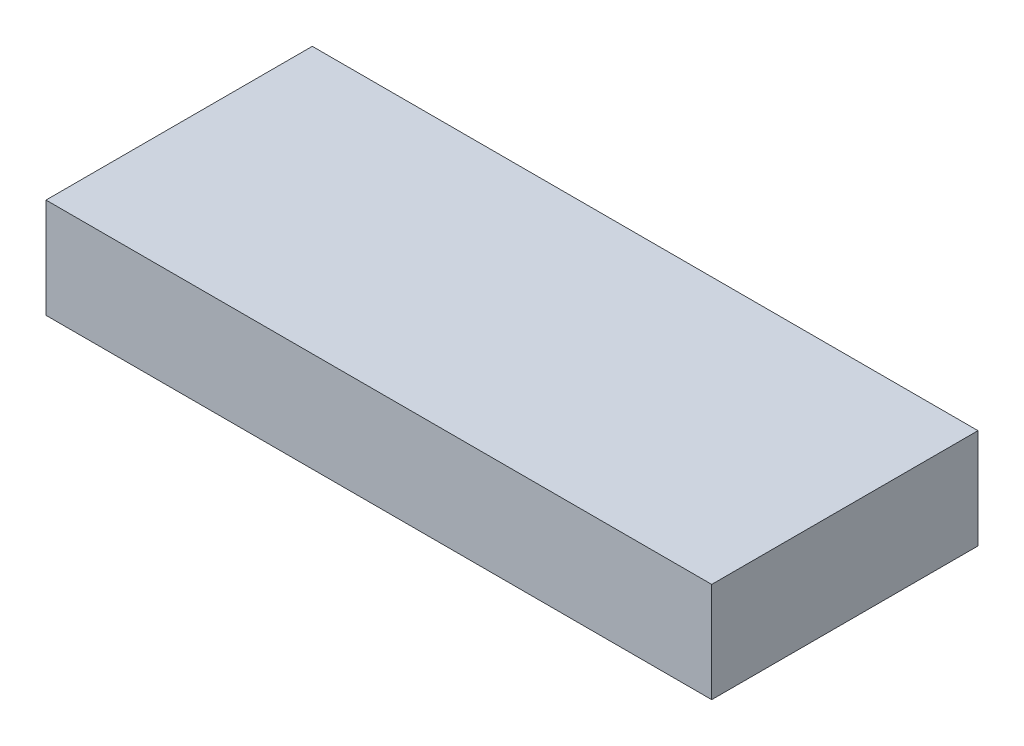
ISO-10303-21;
HEADER;
FILE_DESCRIPTION(('STEP AP214'),'2;1');
FILE_NAME('part.step','',(''),(''),'','','');
FILE_SCHEMA(('AUTOMOTIVE_DESIGN { 1 0 10303 214 1 1 1 1 }'));
ENDSEC;
DATA;
#1=APPLICATION_CONTEXT('core data for automotive mechanical design processes');
#2=APPLICATION_PROTOCOL_DEFINITION('international standard','automotive_design',2000,#1);
#3=PRODUCT_CONTEXT('',#1,'mechanical');
#4=PRODUCT('Part','Part','',(#3));
#5=PRODUCT_RELATED_PRODUCT_CATEGORY('part','',(#4));
#6=PRODUCT_DEFINITION_FORMATION('','',#4);
#7=PRODUCT_DEFINITION_CONTEXT('part definition',#1,'design');
#8=PRODUCT_DEFINITION('design','',#6,#7);
#9=PRODUCT_DEFINITION_SHAPE('','',#8);
#10=(LENGTH_UNIT() NAMED_UNIT(*) SI_UNIT(.MILLI.,.METRE.));
#11=(NAMED_UNIT(*) PLANE_ANGLE_UNIT() SI_UNIT($,.RADIAN.));
#12=(NAMED_UNIT(*) SI_UNIT($,.STERADIAN.) SOLID_ANGLE_UNIT());
#13=UNCERTAINTY_MEASURE_WITH_UNIT(LENGTH_MEASURE(1.E-05),#10,'distance_accuracy_value','');
#14=(GEOMETRIC_REPRESENTATION_CONTEXT(3) GLOBAL_UNCERTAINTY_ASSIGNED_CONTEXT((#13)) GLOBAL_UNIT_ASSIGNED_CONTEXT((#10,
#11,#12)) REPRESENTATION_CONTEXT('',''));
#15=CARTESIAN_POINT('',(0.,0.,0.));
#16=DIRECTION('',(0.,0.,1.));
#17=DIRECTION('',(1.,0.,0.));
#18=AXIS2_PLACEMENT_3D('',#15,#16,#17);
#19=CARTESIAN_POINT('',(31.75,9.525,-12.7));
#20=DIRECTION('',(-1.,0.,0.));
#21=DIRECTION('',(0.,0.,1.));
#22=AXIS2_PLACEMENT_3D('',#19,#20,#21);
#23=PLANE('',#22);
#24=DIRECTION('',(0.,0.,-1.));
#25=VECTOR('',#24,1.);
#26=CARTESIAN_POINT('',(31.75,0.,-12.7));
#27=LINE('',#26,#25);
#28=CARTESIAN_POINT('',(31.75,0.,12.7));
#29=VERTEX_POINT('',#28);
#30=CARTESIAN_POINT('',(31.75,0.,-12.7));
#31=VERTEX_POINT('',#30);
#32=EDGE_CURVE('E102',#29,#31,#27,.T.);
#33=ORIENTED_EDGE('',*,*,#32,.T.);
#34=DIRECTION('',(0.,-1.,0.));
#35=VECTOR('',#34,1.);
#36=CARTESIAN_POINT('',(31.75,9.525,-12.7));
#37=LINE('',#36,#35);
#38=CARTESIAN_POINT('',(31.75,9.525,-12.7));
#39=VERTEX_POINT('',#38);
#40=EDGE_CURVE('E11',#39,#31,#37,.T.);
#41=ORIENTED_EDGE('',*,*,#40,.F.);
#42=DIRECTION('',(0.,0.,-1.));
#43=VECTOR('',#42,1.);
#44=CARTESIAN_POINT('',(31.75,9.525,-12.7));
#45=LINE('',#44,#43);
#46=CARTESIAN_POINT('',(31.75,9.525,12.7));
#47=VERTEX_POINT('',#46);
#48=EDGE_CURVE('E90',#47,#39,#45,.T.);
#49=ORIENTED_EDGE('',*,*,#48,.F.);
#50=DIRECTION('',(0.,-1.,0.));
#51=VECTOR('',#50,1.);
#52=CARTESIAN_POINT('',(31.75,9.525,12.7));
#53=LINE('',#52,#51);
#54=EDGE_CURVE('E98',#47,#29,#53,.T.);
#55=ORIENTED_EDGE('',*,*,#54,.T.);
#56=EDGE_LOOP('',(#33,#41,#49,#55));
#57=FACE_BOUND('',#56,.T.);
#58=ADVANCED_FACE('F38',(#57),#23,.F.);
#59=CARTESIAN_POINT('',(-31.75,9.525,-12.7));
#60=DIRECTION('',(0.,0.,1.));
#61=DIRECTION('',(1.,0.,0.));
#62=AXIS2_PLACEMENT_3D('',#59,#60,#61);
#63=PLANE('',#62);
#64=DIRECTION('',(-1.,0.,0.));
#65=VECTOR('',#64,1.);
#66=CARTESIAN_POINT('',(-31.75,0.,-12.7));
#67=LINE('',#66,#65);
#68=CARTESIAN_POINT('',(-31.75,0.,-12.7));
#69=VERTEX_POINT('',#68);
#70=EDGE_CURVE('E94',#31,#69,#67,.T.);
#71=ORIENTED_EDGE('',*,*,#70,.T.);
#72=DIRECTION('',(0.,-1.,0.));
#73=VECTOR('',#72,1.);
#74=CARTESIAN_POINT('',(-31.75,9.525,-12.7));
#75=LINE('',#74,#73);
#76=CARTESIAN_POINT('',(-31.75,9.525,-12.7));
#77=VERTEX_POINT('',#76);
#78=EDGE_CURVE('E46',#77,#69,#75,.T.);
#79=ORIENTED_EDGE('',*,*,#78,.F.);
#80=DIRECTION('',(-1.,0.,0.));
#81=VECTOR('',#80,1.);
#82=CARTESIAN_POINT('',(-31.75,9.525,-12.7));
#83=LINE('',#82,#81);
#84=EDGE_CURVE('E85',#39,#77,#83,.T.);
#85=ORIENTED_EDGE('',*,*,#84,.F.);
#86=ORIENTED_EDGE('',*,*,#40,.T.);
#87=EDGE_LOOP('',(#71,#79,#85,#86));
#88=FACE_BOUND('',#87,.T.);
#89=ADVANCED_FACE('F93',(#88),#63,.F.);
#90=CARTESIAN_POINT('',(-31.75,9.525,-12.7));
#91=DIRECTION('',(1.,0.,0.));
#92=DIRECTION('',(0.,0.,-1.));
#93=AXIS2_PLACEMENT_3D('',#90,#91,#92);
#94=PLANE('',#93);
#95=DIRECTION('',(0.,0.,1.));
#96=VECTOR('',#95,1.);
#97=CARTESIAN_POINT('',(-31.75,0.,-12.7));
#98=LINE('',#97,#96);
#99=CARTESIAN_POINT('',(-31.75,0.,12.7));
#100=VERTEX_POINT('',#99);
#101=EDGE_CURVE('E72',#69,#100,#98,.T.);
#102=ORIENTED_EDGE('',*,*,#101,.T.);
#103=DIRECTION('',(0.,-1.,0.));
#104=VECTOR('',#103,1.);
#105=CARTESIAN_POINT('',(-31.75,9.525,12.7));
#106=LINE('',#105,#104);
#107=CARTESIAN_POINT('',(-31.75,9.525,12.7));
#108=VERTEX_POINT('',#107);
#109=EDGE_CURVE('E95',#108,#100,#106,.T.);
#110=ORIENTED_EDGE('',*,*,#109,.F.);
#111=DIRECTION('',(0.,0.,1.));
#112=VECTOR('',#111,1.);
#113=CARTESIAN_POINT('',(-31.75,9.525,-12.7));
#114=LINE('',#113,#112);
#115=EDGE_CURVE('E88',#77,#108,#114,.T.);
#116=ORIENTED_EDGE('',*,*,#115,.F.);
#117=ORIENTED_EDGE('',*,*,#78,.T.);
#118=EDGE_LOOP('',(#102,#110,#116,#117));
#119=FACE_BOUND('',#118,.T.);
#120=ADVANCED_FACE('F96',(#119),#94,.F.);
#121=CARTESIAN_POINT('',(-31.75,9.525,12.7));
#122=DIRECTION('',(0.,0.,-1.));
#123=DIRECTION('',(-1.,0.,0.));
#124=AXIS2_PLACEMENT_3D('',#121,#122,#123);
#125=PLANE('',#124);
#126=DIRECTION('',(1.,0.,0.));
#127=VECTOR('',#126,1.);
#128=CARTESIAN_POINT('',(-31.75,0.,12.7));
#129=LINE('',#128,#127);
#130=EDGE_CURVE('E78',#100,#29,#129,.T.);
#131=ORIENTED_EDGE('',*,*,#130,.T.);
#132=ORIENTED_EDGE('',*,*,#54,.F.);
#133=DIRECTION('',(1.,0.,0.));
#134=VECTOR('',#133,1.);
#135=CARTESIAN_POINT('',(-31.75,9.525,12.7));
#136=LINE('',#135,#134);
#137=EDGE_CURVE('E54',#108,#47,#136,.T.);
#138=ORIENTED_EDGE('',*,*,#137,.F.);
#139=ORIENTED_EDGE('',*,*,#109,.T.);
#140=EDGE_LOOP('',(#131,#132,#138,#139));
#141=FACE_BOUND('',#140,.T.);
#142=ADVANCED_FACE('F111',(#141),#125,.F.);
#143=CARTESIAN_POINT('',(0.,9.525,0.));
#144=DIRECTION('',(0.,1.,0.));
#145=DIRECTION('',(0.,0.,1.));
#146=AXIS2_PLACEMENT_3D('',#143,#144,#145);
#147=PLANE('',#146);
#148=ORIENTED_EDGE('',*,*,#48,.T.);
#149=ORIENTED_EDGE('',*,*,#84,.T.);
#150=ORIENTED_EDGE('',*,*,#115,.T.);
#151=ORIENTED_EDGE('',*,*,#137,.T.);
#152=EDGE_LOOP('',(#148,#149,#150,#151));
#153=FACE_BOUND('',#152,.T.);
#154=ADVANCED_FACE('F86',(#153),#147,.T.);
#155=CARTESIAN_POINT('',(0.,0.,0.));
#156=DIRECTION('',(0.,1.,0.));
#157=DIRECTION('',(0.,0.,1.));
#158=AXIS2_PLACEMENT_3D('',#155,#156,#157);
#159=PLANE('',#158);
#160=ORIENTED_EDGE('',*,*,#32,.F.);
#161=ORIENTED_EDGE('',*,*,#130,.F.);
#162=ORIENTED_EDGE('',*,*,#101,.F.);
#163=ORIENTED_EDGE('',*,*,#70,.F.);
#164=EDGE_LOOP('',(#160,#161,#162,#163));
#165=FACE_BOUND('',#164,.T.);
#166=ADVANCED_FACE('F114',(#165),#159,.F.);
#167=CLOSED_SHELL('',(#58,#89,#120,#142,#154,#166));
#168=MANIFOLD_SOLID_BREP('B2',#167);
#169=ADVANCED_BREP_SHAPE_REPRESENTATION('',(#18,#168),#14);
#170=SHAPE_DEFINITION_REPRESENTATION(#9,#169);
ENDSEC;
END-ISO-10303-21;
